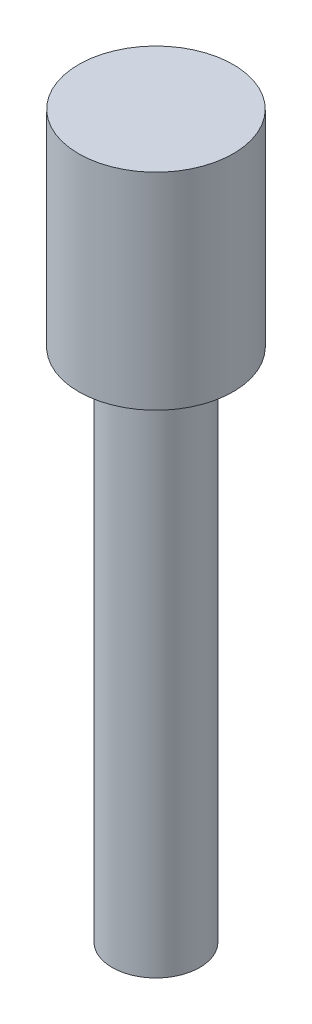
ISO-10303-21;
HEADER;
FILE_DESCRIPTION(('STEP AP214'),'2;1');
FILE_NAME('part.step','',(''),(''),'','','');
FILE_SCHEMA(('AUTOMOTIVE_DESIGN { 1 0 10303 214 1 1 1 1 }'));
ENDSEC;
DATA;
#1=APPLICATION_CONTEXT('core data for automotive mechanical design processes');
#2=APPLICATION_PROTOCOL_DEFINITION('international standard','automotive_design',2000,#1);
#3=PRODUCT_CONTEXT('',#1,'mechanical');
#4=PRODUCT('Part','Part','',(#3));
#5=PRODUCT_RELATED_PRODUCT_CATEGORY('part','',(#4));
#6=PRODUCT_DEFINITION_FORMATION('','',#4);
#7=PRODUCT_DEFINITION_CONTEXT('part definition',#1,'design');
#8=PRODUCT_DEFINITION('design','',#6,#7);
#9=PRODUCT_DEFINITION_SHAPE('','',#8);
#10=(LENGTH_UNIT() NAMED_UNIT(*) SI_UNIT(.MILLI.,.METRE.));
#11=(NAMED_UNIT(*) PLANE_ANGLE_UNIT() SI_UNIT($,.RADIAN.));
#12=(NAMED_UNIT(*) SI_UNIT($,.STERADIAN.) SOLID_ANGLE_UNIT());
#13=UNCERTAINTY_MEASURE_WITH_UNIT(LENGTH_MEASURE(1.E-05),#10,'distance_accuracy_value','');
#14=(GEOMETRIC_REPRESENTATION_CONTEXT(3) GLOBAL_UNCERTAINTY_ASSIGNED_CONTEXT((#13)) GLOBAL_UNIT_ASSIGNED_CONTEXT((#10,
#11,#12)) REPRESENTATION_CONTEXT('',''));
#15=CARTESIAN_POINT('',(0.,0.,0.));
#16=DIRECTION('',(0.,0.,1.));
#17=DIRECTION('',(1.,0.,0.));
#18=AXIS2_PLACEMENT_3D('',#15,#16,#17);
#19=CARTESIAN_POINT('',(0.,127.,0.));
#20=DIRECTION('',(0.,-1.,0.));
#21=DIRECTION('',(0.,0.,-1.));
#22=AXIS2_PLACEMENT_3D('',#19,#20,#21);
#23=CYLINDRICAL_SURFACE('',#22,10.795);
#24=CARTESIAN_POINT('',(0.,127.,0.));
#25=DIRECTION('',(0.,1.,0.));
#26=DIRECTION('',(0.,0.,1.));
#27=AXIS2_PLACEMENT_3D('',#24,#25,#26);
#28=CIRCLE('',#27,10.795);
#29=CARTESIAN_POINT('',(0.,127.,10.795));
#30=VERTEX_POINT('',#29);
#31=EDGE_CURVE('E12',#30,#30,#28,.T.);
#32=ORIENTED_EDGE('',*,*,#31,.F.);
#33=EDGE_LOOP('',(#32));
#34=FACE_BOUND('',#33,.T.);
#35=CARTESIAN_POINT('',(0.,0.,0.));
#36=DIRECTION('',(0.,1.,0.));
#37=DIRECTION('',(0.,0.,1.));
#38=AXIS2_PLACEMENT_3D('',#35,#36,#37);
#39=CIRCLE('',#38,10.795);
#40=CARTESIAN_POINT('',(0.,0.,10.795));
#41=VERTEX_POINT('',#40);
#42=EDGE_CURVE('E49',#41,#41,#39,.T.);
#43=ORIENTED_EDGE('',*,*,#42,.T.);
#44=EDGE_LOOP('',(#43));
#45=FACE_BOUND('',#44,.T.);
#46=ADVANCED_FACE('F46',(#34,#45),#23,.T.);
#47=CARTESIAN_POINT('',(0.,0.,0.));
#48=DIRECTION('',(0.,1.,0.));
#49=DIRECTION('',(0.,0.,1.));
#50=AXIS2_PLACEMENT_3D('',#47,#48,#49);
#51=PLANE('',#50);
#52=ORIENTED_EDGE('',*,*,#42,.F.);
#53=EDGE_LOOP('',(#52));
#54=FACE_BOUND('',#53,.T.);
#55=ADVANCED_FACE('F69',(#54),#51,.F.);
#56=CARTESIAN_POINT('',(0.,177.8,0.));
#57=DIRECTION('',(0.,-1.,0.));
#58=DIRECTION('',(0.,0.,-1.));
#59=AXIS2_PLACEMENT_3D('',#56,#57,#58);
#60=CYLINDRICAL_SURFACE('',#59,19.05);
#61=CARTESIAN_POINT('',(0.,177.8,0.));
#62=DIRECTION('',(0.,1.,0.));
#63=DIRECTION('',(0.,0.,1.));
#64=AXIS2_PLACEMENT_3D('',#61,#62,#63);
#65=CIRCLE('',#64,19.05);
#66=CARTESIAN_POINT('',(0.,177.8,19.05));
#67=VERTEX_POINT('',#66);
#68=EDGE_CURVE('E56',#67,#67,#65,.T.);
#69=ORIENTED_EDGE('',*,*,#68,.F.);
#70=EDGE_LOOP('',(#69));
#71=FACE_BOUND('',#70,.T.);
#72=CARTESIAN_POINT('',(0.,127.,0.));
#73=DIRECTION('',(0.,1.,0.));
#74=DIRECTION('',(0.,0.,1.));
#75=AXIS2_PLACEMENT_3D('',#72,#73,#74);
#76=CIRCLE('',#75,19.05);
#77=CARTESIAN_POINT('',(0.,127.,19.05));
#78=VERTEX_POINT('',#77);
#79=EDGE_CURVE('E58',#78,#78,#76,.T.);
#80=ORIENTED_EDGE('',*,*,#79,.T.);
#81=EDGE_LOOP('',(#80));
#82=FACE_BOUND('',#81,.T.);
#83=ADVANCED_FACE('F66',(#71,#82),#60,.T.);
#84=CARTESIAN_POINT('',(0.,177.8,0.));
#85=DIRECTION('',(0.,1.,0.));
#86=DIRECTION('',(0.,0.,1.));
#87=AXIS2_PLACEMENT_3D('',#84,#85,#86);
#88=PLANE('',#87);
#89=ORIENTED_EDGE('',*,*,#68,.T.);
#90=EDGE_LOOP('',(#89));
#91=FACE_BOUND('',#90,.T.);
#92=ADVANCED_FACE('F64',(#91),#88,.T.);
#93=CARTESIAN_POINT('',(0.,127.,0.));
#94=DIRECTION('',(0.,1.,0.));
#95=DIRECTION('',(0.,0.,1.));
#96=AXIS2_PLACEMENT_3D('',#93,#94,#95);
#97=PLANE('',#96);
#98=ORIENTED_EDGE('',*,*,#31,.T.);
#99=EDGE_LOOP('',(#98));
#100=FACE_BOUND('',#99,.T.);
#101=ORIENTED_EDGE('',*,*,#79,.F.);
#102=EDGE_LOOP('',(#101));
#103=FACE_BOUND('',#102,.T.);
#104=ADVANCED_FACE('F73',(#100,#103),#97,.F.);
#105=CLOSED_SHELL('',(#46,#55,#83,#92,#104));
#106=MANIFOLD_SOLID_BREP('B2',#105);
#107=ADVANCED_BREP_SHAPE_REPRESENTATION('',(#18,#106),#14);
#108=SHAPE_DEFINITION_REPRESENTATION(#9,#107);
ENDSEC;
END-ISO-10303-21;
